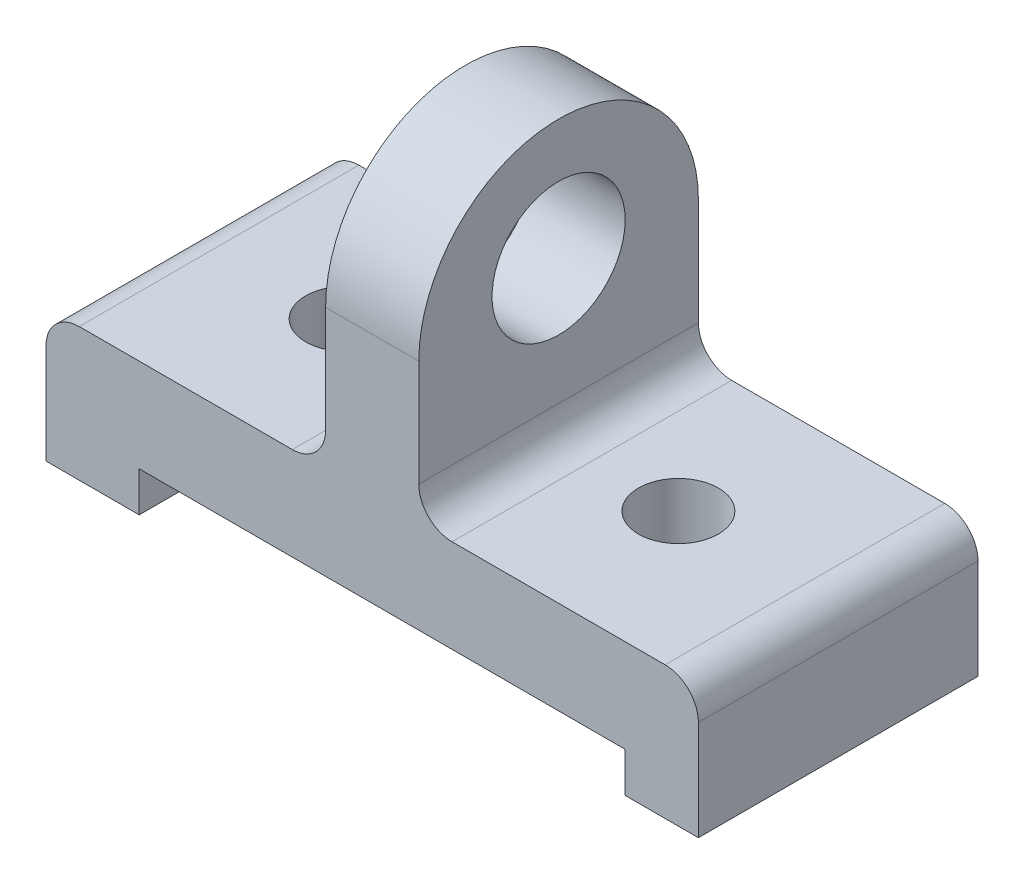
ISO-10303-21;
HEADER;
FILE_DESCRIPTION(('STEP AP214'),'2;1');
FILE_NAME('part.step','',(''),(''),'','','');
FILE_SCHEMA(('AUTOMOTIVE_DESIGN { 1 0 10303 214 1 1 1 1 }'));
ENDSEC;
DATA;
#1=APPLICATION_CONTEXT('core data for automotive mechanical design processes');
#2=APPLICATION_PROTOCOL_DEFINITION('international standard','automotive_design',2000,#1);
#3=PRODUCT_CONTEXT('',#1,'mechanical');
#4=PRODUCT('Part','Part','',(#3));
#5=PRODUCT_RELATED_PRODUCT_CATEGORY('part','',(#4));
#6=PRODUCT_DEFINITION_FORMATION('','',#4);
#7=PRODUCT_DEFINITION_CONTEXT('part definition',#1,'design');
#8=PRODUCT_DEFINITION('design','',#6,#7);
#9=PRODUCT_DEFINITION_SHAPE('','',#8);
#10=(LENGTH_UNIT() NAMED_UNIT(*) SI_UNIT(.MILLI.,.METRE.));
#11=(NAMED_UNIT(*) PLANE_ANGLE_UNIT() SI_UNIT($,.RADIAN.));
#12=(NAMED_UNIT(*) SI_UNIT($,.STERADIAN.) SOLID_ANGLE_UNIT());
#13=UNCERTAINTY_MEASURE_WITH_UNIT(LENGTH_MEASURE(1.E-05),#10,'distance_accuracy_value','');
#14=(GEOMETRIC_REPRESENTATION_CONTEXT(3) GLOBAL_UNCERTAINTY_ASSIGNED_CONTEXT((#13)) GLOBAL_UNIT_ASSIGNED_CONTEXT((#10,
#11,#12)) REPRESENTATION_CONTEXT('',''));
#15=CARTESIAN_POINT('',(0.,0.,0.));
#16=DIRECTION('',(0.,0.,1.));
#17=DIRECTION('',(1.,0.,0.));
#18=AXIS2_PLACEMENT_3D('',#15,#16,#17);
#19=CARTESIAN_POINT('',(0.,14.,0.));
#20=DIRECTION('',(0.,1.,0.));
#21=DIRECTION('',(0.,0.,1.));
#22=AXIS2_PLACEMENT_3D('',#19,#20,#21);
#23=PLANE('',#22);
#24=CARTESIAN_POINT('',(25.,14.,0.));
#25=DIRECTION('',(0.,1.,0.));
#26=DIRECTION('',(0.,0.,1.));
#27=AXIS2_PLACEMENT_3D('',#24,#25,#26);
#28=CIRCLE('',#27,6.);
#29=CARTESIAN_POINT('',(25.,14.,6.));
#30=VERTEX_POINT('',#29);
#31=EDGE_CURVE('E184',#30,#30,#28,.T.);
#32=ORIENTED_EDGE('',*,*,#31,.F.);
#33=EDGE_LOOP('',(#32));
#34=FACE_BOUND('',#33,.T.);
#35=DIRECTION('',(-1.,0.,0.));
#36=VECTOR('',#35,1.);
#37=CARTESIAN_POINT('',(-49.,14.,-21.));
#38=LINE('',#37,#36);
#39=CARTESIAN_POINT('',(44.,14.,-21.));
#40=VERTEX_POINT('',#39);
#41=CARTESIAN_POINT('',(12.,14.,-21.));
#42=VERTEX_POINT('',#41);
#43=EDGE_CURVE('E234',#40,#42,#38,.T.);
#44=ORIENTED_EDGE('',*,*,#43,.T.);
#45=DIRECTION('',(0.,0.,-1.));
#46=VECTOR('',#45,1.);
#47=CARTESIAN_POINT('',(12.,14.,0.));
#48=LINE('',#47,#46);
#49=CARTESIAN_POINT('',(12.,14.,21.));
#50=VERTEX_POINT('',#49);
#51=EDGE_CURVE('E275',#42,#50,#48,.F.);
#52=ORIENTED_EDGE('',*,*,#51,.T.);
#53=DIRECTION('',(1.,0.,0.));
#54=VECTOR('',#53,1.);
#55=CARTESIAN_POINT('',(-49.,14.,21.));
#56=LINE('',#55,#54);
#57=CARTESIAN_POINT('',(44.,14.,21.));
#58=VERTEX_POINT('',#57);
#59=EDGE_CURVE('E237',#50,#58,#56,.T.);
#60=ORIENTED_EDGE('',*,*,#59,.T.);
#61=DIRECTION('',(0.,0.,-1.));
#62=VECTOR('',#61,1.);
#63=CARTESIAN_POINT('',(44.,14.,-21.));
#64=LINE('',#63,#62);
#65=EDGE_CURVE('E254',#58,#40,#64,.T.);
#66=ORIENTED_EDGE('',*,*,#65,.T.);
#67=EDGE_LOOP('',(#44,#52,#60,#66));
#68=FACE_BOUND('',#67,.T.);
#69=ADVANCED_FACE('F33',(#34,#68),#23,.T.);
#70=CARTESIAN_POINT('',(49.,14.,-21.));
#71=DIRECTION('',(-1.,0.,0.));
#72=DIRECTION('',(0.,0.,1.));
#73=AXIS2_PLACEMENT_3D('',#70,#71,#72);
#74=PLANE('',#73);
#75=DIRECTION('',(0.,-1.,0.));
#76=VECTOR('',#75,1.);
#77=CARTESIAN_POINT('',(49.,14.,-21.));
#78=LINE('',#77,#76);
#79=CARTESIAN_POINT('',(49.,9.,-21.));
#80=VERTEX_POINT('',#79);
#81=CARTESIAN_POINT('',(49.,-6.,-21.));
#82=VERTEX_POINT('',#81);
#83=EDGE_CURVE('E252',#80,#82,#78,.T.);
#84=ORIENTED_EDGE('',*,*,#83,.F.);
#85=DIRECTION('',(0.,0.,-1.));
#86=VECTOR('',#85,1.);
#87=CARTESIAN_POINT('',(49.,9.,21.));
#88=LINE('',#87,#86);
#89=CARTESIAN_POINT('',(49.,9.,21.));
#90=VERTEX_POINT('',#89);
#91=EDGE_CURVE('E259',#80,#90,#88,.F.);
#92=ORIENTED_EDGE('',*,*,#91,.T.);
#93=DIRECTION('',(0.,-1.,0.));
#94=VECTOR('',#93,1.);
#95=CARTESIAN_POINT('',(49.,14.,21.));
#96=LINE('',#95,#94);
#97=CARTESIAN_POINT('',(49.,-6.,21.));
#98=VERTEX_POINT('',#97);
#99=EDGE_CURVE('E242',#90,#98,#96,.T.);
#100=ORIENTED_EDGE('',*,*,#99,.T.);
#101=DIRECTION('',(0.,0.,1.));
#102=VECTOR('',#101,1.);
#103=CARTESIAN_POINT('',(49.,-6.,-21.));
#104=LINE('',#103,#102);
#105=EDGE_CURVE('E226',#82,#98,#104,.T.);
#106=ORIENTED_EDGE('',*,*,#105,.F.);
#107=EDGE_LOOP('',(#84,#92,#100,#106));
#108=FACE_BOUND('',#107,.T.);
#109=ADVANCED_FACE('F307',(#108),#74,.F.);
#110=CARTESIAN_POINT('',(-49.,14.,-21.));
#111=DIRECTION('',(0.,0.,1.));
#112=DIRECTION('',(1.,0.,0.));
#113=AXIS2_PLACEMENT_3D('',#110,#111,#112);
#114=PLANE('',#113);
#115=DIRECTION('',(0.,-1.,0.));
#116=VECTOR('',#115,1.);
#117=CARTESIAN_POINT('',(-49.,14.,-21.));
#118=LINE('',#117,#116);
#119=CARTESIAN_POINT('',(-49.,9.,-21.));
#120=VERTEX_POINT('',#119);
#121=CARTESIAN_POINT('',(-49.,-6.,-21.));
#122=VERTEX_POINT('',#121);
#123=EDGE_CURVE('E250',#120,#122,#118,.T.);
#124=ORIENTED_EDGE('',*,*,#123,.F.);
#125=CARTESIAN_POINT('',(-44.,9.,-21.));
#126=DIRECTION('',(0.,0.,1.));
#127=DIRECTION('',(1.,0.,0.));
#128=AXIS2_PLACEMENT_3D('',#125,#126,#127);
#129=CIRCLE('',#128,5.);
#130=CARTESIAN_POINT('',(-44.,14.,-21.));
#131=VERTEX_POINT('',#130);
#132=EDGE_CURVE('E271',#120,#131,#129,.F.);
#133=ORIENTED_EDGE('',*,*,#132,.T.);
#134=CARTESIAN_POINT('',(-12.,14.,-21.));
#135=VERTEX_POINT('',#134);
#136=EDGE_CURVE('E238',#135,#131,#38,.T.);
#137=ORIENTED_EDGE('',*,*,#136,.F.);
#138=CARTESIAN_POINT('',(-12.,19.,-21.));
#139=DIRECTION('',(0.,0.,1.));
#140=DIRECTION('',(1.,0.,0.));
#141=AXIS2_PLACEMENT_3D('',#138,#139,#140);
#142=CIRCLE('',#141,5.);
#143=CARTESIAN_POINT('',(-7.,19.,-21.));
#144=VERTEX_POINT('',#143);
#145=EDGE_CURVE('E41',#135,#144,#142,.T.);
#146=ORIENTED_EDGE('',*,*,#145,.T.);
#147=DIRECTION('',(0.,1.,0.));
#148=VECTOR('',#147,1.);
#149=CARTESIAN_POINT('',(-7.,14.,-21.));
#150=LINE('',#149,#148);
#151=CARTESIAN_POINT('',(-7.,35.,-21.));
#152=VERTEX_POINT('',#151);
#153=EDGE_CURVE('E162',#144,#152,#150,.T.);
#154=ORIENTED_EDGE('',*,*,#153,.T.);
#155=DIRECTION('',(1.,0.,0.));
#156=VECTOR('',#155,1.);
#157=CARTESIAN_POINT('',(-7.,35.,-21.));
#158=LINE('',#157,#156);
#159=CARTESIAN_POINT('',(7.,35.,-21.));
#160=VERTEX_POINT('',#159);
#161=EDGE_CURVE('E159',#152,#160,#158,.T.);
#162=ORIENTED_EDGE('',*,*,#161,.T.);
#163=DIRECTION('',(0.,1.,0.));
#164=VECTOR('',#163,1.);
#165=CARTESIAN_POINT('',(7.,14.,-21.));
#166=LINE('',#165,#164);
#167=CARTESIAN_POINT('',(7.,19.,-21.));
#168=VERTEX_POINT('',#167);
#169=EDGE_CURVE('E146',#168,#160,#166,.T.);
#170=ORIENTED_EDGE('',*,*,#169,.F.);
#171=CARTESIAN_POINT('',(12.,19.,-21.));
#172=DIRECTION('',(0.,0.,1.));
#173=DIRECTION('',(1.,0.,0.));
#174=AXIS2_PLACEMENT_3D('',#171,#172,#173);
#175=CIRCLE('',#174,5.);
#176=EDGE_CURVE('E277',#168,#42,#175,.T.);
#177=ORIENTED_EDGE('',*,*,#176,.T.);
#178=ORIENTED_EDGE('',*,*,#43,.F.);
#179=CARTESIAN_POINT('',(44.,9.,-21.));
#180=DIRECTION('',(0.,0.,1.));
#181=DIRECTION('',(1.,0.,0.));
#182=AXIS2_PLACEMENT_3D('',#179,#180,#181);
#183=CIRCLE('',#182,5.);
#184=EDGE_CURVE('E257',#40,#80,#183,.F.);
#185=ORIENTED_EDGE('',*,*,#184,.T.);
#186=ORIENTED_EDGE('',*,*,#83,.T.);
#187=DIRECTION('',(1.,0.,0.));
#188=VECTOR('',#187,1.);
#189=CARTESIAN_POINT('',(49.,-6.,-21.));
#190=LINE('',#189,#188);
#191=CARTESIAN_POINT('',(37.9824474250704,-6.,-21.));
#192=VERTEX_POINT('',#191);
#193=EDGE_CURVE('E222',#192,#82,#190,.T.);
#194=ORIENTED_EDGE('',*,*,#193,.F.);
#195=DIRECTION('',(0.,-1.,0.));
#196=VECTOR('',#195,1.);
#197=CARTESIAN_POINT('',(37.9824474250704,-6.,-21.));
#198=LINE('',#197,#196);
#199=CARTESIAN_POINT('',(37.9824474250704,0.,-21.));
#200=VERTEX_POINT('',#199);
#201=EDGE_CURVE('E219',#200,#192,#198,.T.);
#202=ORIENTED_EDGE('',*,*,#201,.F.);
#203=DIRECTION('',(-1.,0.,0.));
#204=VECTOR('',#203,1.);
#205=CARTESIAN_POINT('',(-49.,0.,-21.));
#206=LINE('',#205,#204);
#207=CARTESIAN_POINT('',(-35.,0.,-21.));
#208=VERTEX_POINT('',#207);
#209=EDGE_CURVE('E229',#200,#208,#206,.T.);
#210=ORIENTED_EDGE('',*,*,#209,.T.);
#211=DIRECTION('',(0.,1.,0.));
#212=VECTOR('',#211,1.);
#213=CARTESIAN_POINT('',(-35.,-6.,-21.));
#214=LINE('',#213,#212);
#215=CARTESIAN_POINT('',(-35.,-6.,-21.));
#216=VERTEX_POINT('',#215);
#217=EDGE_CURVE('E199',#216,#208,#214,.T.);
#218=ORIENTED_EDGE('',*,*,#217,.F.);
#219=DIRECTION('',(1.,0.,0.));
#220=VECTOR('',#219,1.);
#221=CARTESIAN_POINT('',(-49.,-6.,-21.));
#222=LINE('',#221,#220);
#223=EDGE_CURVE('E196',#122,#216,#222,.T.);
#224=ORIENTED_EDGE('',*,*,#223,.F.);
#225=EDGE_LOOP('',(#124,#133,#137,#146,#154,#162,#170,#177,#178,#185,#186,#194,#202,#210,#218,#224));
#226=FACE_BOUND('',#225,.T.);
#227=ADVANCED_FACE('F161',(#226),#114,.F.);
#228=CARTESIAN_POINT('',(-49.,14.,-21.));
#229=DIRECTION('',(1.,0.,0.));
#230=DIRECTION('',(0.,0.,-1.));
#231=AXIS2_PLACEMENT_3D('',#228,#229,#230);
#232=PLANE('',#231);
#233=DIRECTION('',(0.,-1.,0.));
#234=VECTOR('',#233,1.);
#235=CARTESIAN_POINT('',(-49.,14.,21.));
#236=LINE('',#235,#234);
#237=CARTESIAN_POINT('',(-49.,9.,21.));
#238=VERTEX_POINT('',#237);
#239=CARTESIAN_POINT('',(-49.,-6.,21.));
#240=VERTEX_POINT('',#239);
#241=EDGE_CURVE('E248',#238,#240,#236,.T.);
#242=ORIENTED_EDGE('',*,*,#241,.F.);
#243=DIRECTION('',(0.,0.,1.));
#244=VECTOR('',#243,1.);
#245=CARTESIAN_POINT('',(-49.,9.,-21.));
#246=LINE('',#245,#244);
#247=EDGE_CURVE('E269',#238,#120,#246,.F.);
#248=ORIENTED_EDGE('',*,*,#247,.T.);
#249=ORIENTED_EDGE('',*,*,#123,.T.);
#250=DIRECTION('',(0.,0.,1.));
#251=VECTOR('',#250,1.);
#252=CARTESIAN_POINT('',(-49.,-6.,-21.));
#253=LINE('',#252,#251);
#254=EDGE_CURVE('E202',#122,#240,#253,.T.);
#255=ORIENTED_EDGE('',*,*,#254,.T.);
#256=EDGE_LOOP('',(#242,#248,#249,#255));
#257=FACE_BOUND('',#256,.T.);
#258=ADVANCED_FACE('F327',(#257),#232,.F.);
#259=CARTESIAN_POINT('',(-49.,14.,21.));
#260=DIRECTION('',(0.,0.,-1.));
#261=DIRECTION('',(-1.,0.,0.));
#262=AXIS2_PLACEMENT_3D('',#259,#260,#261);
#263=PLANE('',#262);
#264=CARTESIAN_POINT('',(-44.,14.,21.));
#265=VERTEX_POINT('',#264);
#266=CARTESIAN_POINT('',(-12.,14.,21.));
#267=VERTEX_POINT('',#266);
#268=EDGE_CURVE('E239',#265,#267,#56,.T.);
#269=ORIENTED_EDGE('',*,*,#268,.F.);
#270=CARTESIAN_POINT('',(-44.,9.,21.));
#271=DIRECTION('',(0.,0.,-1.));
#272=DIRECTION('',(-1.,0.,0.));
#273=AXIS2_PLACEMENT_3D('',#270,#271,#272);
#274=CIRCLE('',#273,5.);
#275=EDGE_CURVE('E267',#265,#238,#274,.F.);
#276=ORIENTED_EDGE('',*,*,#275,.T.);
#277=ORIENTED_EDGE('',*,*,#241,.T.);
#278=DIRECTION('',(1.,0.,0.));
#279=VECTOR('',#278,1.);
#280=CARTESIAN_POINT('',(-49.,-6.,21.));
#281=LINE('',#280,#279);
#282=CARTESIAN_POINT('',(-35.,-6.,21.));
#283=VERTEX_POINT('',#282);
#284=EDGE_CURVE('E187',#240,#283,#281,.T.);
#285=ORIENTED_EDGE('',*,*,#284,.T.);
#286=DIRECTION('',(0.,1.,0.));
#287=VECTOR('',#286,1.);
#288=CARTESIAN_POINT('',(-35.,-6.,21.));
#289=LINE('',#288,#287);
#290=CARTESIAN_POINT('',(-35.,0.,21.));
#291=VERTEX_POINT('',#290);
#292=EDGE_CURVE('E200',#283,#291,#289,.T.);
#293=ORIENTED_EDGE('',*,*,#292,.T.);
#294=DIRECTION('',(1.,0.,0.));
#295=VECTOR('',#294,1.);
#296=CARTESIAN_POINT('',(-49.,0.,21.));
#297=LINE('',#296,#295);
#298=CARTESIAN_POINT('',(37.9824474250704,0.,21.));
#299=VERTEX_POINT('',#298);
#300=EDGE_CURVE('E245',#291,#299,#297,.T.);
#301=ORIENTED_EDGE('',*,*,#300,.T.);
#302=DIRECTION('',(0.,-1.,0.));
#303=VECTOR('',#302,1.);
#304=CARTESIAN_POINT('',(37.9824474250704,-6.,21.));
#305=LINE('',#304,#303);
#306=CARTESIAN_POINT('',(37.9824474250704,-6.,21.));
#307=VERTEX_POINT('',#306);
#308=EDGE_CURVE('E209',#299,#307,#305,.T.);
#309=ORIENTED_EDGE('',*,*,#308,.T.);
#310=DIRECTION('',(1.,0.,0.));
#311=VECTOR('',#310,1.);
#312=CARTESIAN_POINT('',(49.,-6.,21.));
#313=LINE('',#312,#311);
#314=EDGE_CURVE('E216',#307,#98,#313,.T.);
#315=ORIENTED_EDGE('',*,*,#314,.T.);
#316=ORIENTED_EDGE('',*,*,#99,.F.);
#317=CARTESIAN_POINT('',(44.,9.,21.));
#318=DIRECTION('',(0.,0.,-1.));
#319=DIRECTION('',(-1.,0.,0.));
#320=AXIS2_PLACEMENT_3D('',#317,#318,#319);
#321=CIRCLE('',#320,5.);
#322=EDGE_CURVE('E261',#90,#58,#321,.F.);
#323=ORIENTED_EDGE('',*,*,#322,.T.);
#324=ORIENTED_EDGE('',*,*,#59,.F.);
#325=CARTESIAN_POINT('',(12.,19.,21.));
#326=DIRECTION('',(0.,0.,-1.));
#327=DIRECTION('',(-1.,0.,0.));
#328=AXIS2_PLACEMENT_3D('',#325,#326,#327);
#329=CIRCLE('',#328,5.);
#330=CARTESIAN_POINT('',(7.,19.,21.));
#331=VERTEX_POINT('',#330);
#332=EDGE_CURVE('E279',#50,#331,#329,.T.);
#333=ORIENTED_EDGE('',*,*,#332,.T.);
#334=DIRECTION('',(0.,-1.,0.));
#335=VECTOR('',#334,1.);
#336=CARTESIAN_POINT('',(7.,14.,21.));
#337=LINE('',#336,#335);
#338=CARTESIAN_POINT('',(7.,35.,21.));
#339=VERTEX_POINT('',#338);
#340=EDGE_CURVE('E170',#339,#331,#337,.T.);
#341=ORIENTED_EDGE('',*,*,#340,.F.);
#342=DIRECTION('',(1.,0.,0.));
#343=VECTOR('',#342,1.);
#344=CARTESIAN_POINT('',(-7.,35.,21.));
#345=LINE('',#344,#343);
#346=CARTESIAN_POINT('',(-7.,35.,21.));
#347=VERTEX_POINT('',#346);
#348=EDGE_CURVE('E166',#347,#339,#345,.T.);
#349=ORIENTED_EDGE('',*,*,#348,.F.);
#350=DIRECTION('',(0.,-1.,0.));
#351=VECTOR('',#350,1.);
#352=CARTESIAN_POINT('',(-7.,14.,21.));
#353=LINE('',#352,#351);
#354=CARTESIAN_POINT('',(-7.,19.,21.));
#355=VERTEX_POINT('',#354);
#356=EDGE_CURVE('E167',#347,#355,#353,.T.);
#357=ORIENTED_EDGE('',*,*,#356,.T.);
#358=CARTESIAN_POINT('',(-12.,19.,21.));
#359=DIRECTION('',(0.,0.,-1.));
#360=DIRECTION('',(-1.,0.,0.));
#361=AXIS2_PLACEMENT_3D('',#358,#359,#360);
#362=CIRCLE('',#361,5.);
#363=EDGE_CURVE('E11',#355,#267,#362,.T.);
#364=ORIENTED_EDGE('',*,*,#363,.T.);
#365=EDGE_LOOP('',(#269,#276,#277,#285,#293,#301,#309,#315,#316,#323,#324,#333,#341,#349,#357,#364));
#366=FACE_BOUND('',#365,.T.);
#367=ADVANCED_FACE('F298',(#366),#263,.F.);
#368=ORIENTED_EDGE('',*,*,#268,.T.);
#369=DIRECTION('',(0.,0.,-1.));
#370=VECTOR('',#369,1.);
#371=CARTESIAN_POINT('',(-12.,14.,-21.));
#372=LINE('',#371,#370);
#373=EDGE_CURVE('E281',#267,#135,#372,.T.);
#374=ORIENTED_EDGE('',*,*,#373,.T.);
#375=ORIENTED_EDGE('',*,*,#136,.T.);
#376=DIRECTION('',(0.,0.,1.));
#377=VECTOR('',#376,1.);
#378=CARTESIAN_POINT('',(-44.,14.,21.));
#379=LINE('',#378,#377);
#380=EDGE_CURVE('E264',#131,#265,#379,.T.);
#381=ORIENTED_EDGE('',*,*,#380,.T.);
#382=EDGE_LOOP('',(#368,#374,#375,#381));
#383=FACE_BOUND('',#382,.T.);
#384=CARTESIAN_POINT('',(-25.,14.,0.));
#385=DIRECTION('',(0.,1.,0.));
#386=DIRECTION('',(0.,0.,-1.));
#387=AXIS2_PLACEMENT_3D('',#384,#385,#386);
#388=CIRCLE('',#387,6.);
#389=CARTESIAN_POINT('',(-25.,14.,-6.00000000000001));
#390=VERTEX_POINT('',#389);
#391=EDGE_CURVE('E191',#390,#390,#388,.T.);
#392=ORIENTED_EDGE('',*,*,#391,.F.);
#393=EDGE_LOOP('',(#392));
#394=FACE_BOUND('',#393,.T.);
#395=ADVANCED_FACE('F286',(#383,#394),#23,.T.);
#396=CARTESIAN_POINT('',(0.,0.,0.));
#397=DIRECTION('',(0.,1.,0.));
#398=DIRECTION('',(0.,0.,1.));
#399=AXIS2_PLACEMENT_3D('',#396,#397,#398);
#400=PLANE('',#399);
#401=CARTESIAN_POINT('',(25.,0.,0.));
#402=DIRECTION('',(0.,1.,0.));
#403=DIRECTION('',(0.,0.,1.));
#404=AXIS2_PLACEMENT_3D('',#401,#402,#403);
#405=CIRCLE('',#404,6.);
#406=CARTESIAN_POINT('',(25.,0.,6.));
#407=VERTEX_POINT('',#406);
#408=EDGE_CURVE('E188',#407,#407,#405,.T.);
#409=ORIENTED_EDGE('',*,*,#408,.T.);
#410=EDGE_LOOP('',(#409));
#411=FACE_BOUND('',#410,.T.);
#412=CARTESIAN_POINT('',(-25.,0.,0.));
#413=DIRECTION('',(0.,1.,0.));
#414=DIRECTION('',(0.,0.,-1.));
#415=AXIS2_PLACEMENT_3D('',#412,#413,#414);
#416=CIRCLE('',#415,6.);
#417=CARTESIAN_POINT('',(-25.,0.,-6.00000000000001));
#418=VERTEX_POINT('',#417);
#419=EDGE_CURVE('E182',#418,#418,#416,.T.);
#420=ORIENTED_EDGE('',*,*,#419,.T.);
#421=EDGE_LOOP('',(#420));
#422=FACE_BOUND('',#421,.T.);
#423=ORIENTED_EDGE('',*,*,#300,.F.);
#424=DIRECTION('',(0.,0.,1.));
#425=VECTOR('',#424,1.);
#426=CARTESIAN_POINT('',(-35.,0.,-21.));
#427=LINE('',#426,#425);
#428=EDGE_CURVE('E206',#208,#291,#427,.T.);
#429=ORIENTED_EDGE('',*,*,#428,.F.);
#430=ORIENTED_EDGE('',*,*,#209,.F.);
#431=DIRECTION('',(0.,0.,1.));
#432=VECTOR('',#431,1.);
#433=CARTESIAN_POINT('',(37.9824474250704,0.,-21.));
#434=LINE('',#433,#432);
#435=EDGE_CURVE('E225',#200,#299,#434,.T.);
#436=ORIENTED_EDGE('',*,*,#435,.T.);
#437=EDGE_LOOP('',(#423,#429,#430,#436));
#438=FACE_BOUND('',#437,.T.);
#439=ADVANCED_FACE('F320',(#411,#422,#438),#400,.F.);
#440=CARTESIAN_POINT('',(49.,-6.,-21.));
#441=DIRECTION('',(0.,-1.,0.));
#442=DIRECTION('',(1.,0.,0.));
#443=AXIS2_PLACEMENT_3D('',#440,#441,#442);
#444=PLANE('',#443);
#445=ORIENTED_EDGE('',*,*,#105,.T.);
#446=ORIENTED_EDGE('',*,*,#314,.F.);
#447=DIRECTION('',(0.,0.,1.));
#448=VECTOR('',#447,1.);
#449=CARTESIAN_POINT('',(37.9824474250704,-6.,-21.));
#450=LINE('',#449,#448);
#451=EDGE_CURVE('E230',#192,#307,#450,.T.);
#452=ORIENTED_EDGE('',*,*,#451,.F.);
#453=ORIENTED_EDGE('',*,*,#193,.T.);
#454=EDGE_LOOP('',(#445,#446,#452,#453));
#455=FACE_BOUND('',#454,.T.);
#456=ADVANCED_FACE('F325',(#455),#444,.T.);
#457=CARTESIAN_POINT('',(37.9824474250704,-6.,-21.));
#458=DIRECTION('',(-1.,0.,0.));
#459=DIRECTION('',(0.,0.,1.));
#460=AXIS2_PLACEMENT_3D('',#457,#458,#459);
#461=PLANE('',#460);
#462=ORIENTED_EDGE('',*,*,#451,.T.);
#463=ORIENTED_EDGE('',*,*,#308,.F.);
#464=ORIENTED_EDGE('',*,*,#435,.F.);
#465=ORIENTED_EDGE('',*,*,#201,.T.);
#466=EDGE_LOOP('',(#462,#463,#464,#465));
#467=FACE_BOUND('',#466,.T.);
#468=ADVANCED_FACE('F341',(#467),#461,.T.);
#469=CARTESIAN_POINT('',(44.,9.,0.));
#470=DIRECTION('',(0.,0.,1.));
#471=DIRECTION('',(1.,0.,0.));
#472=AXIS2_PLACEMENT_3D('',#469,#470,#471);
#473=CYLINDRICAL_SURFACE('',#472,5.);
#474=ORIENTED_EDGE('',*,*,#322,.F.);
#475=ORIENTED_EDGE('',*,*,#91,.F.);
#476=ORIENTED_EDGE('',*,*,#184,.F.);
#477=ORIENTED_EDGE('',*,*,#65,.F.);
#478=EDGE_LOOP('',(#474,#475,#476,#477));
#479=FACE_BOUND('',#478,.T.);
#480=ADVANCED_FACE('F337',(#479),#473,.T.);
#481=CARTESIAN_POINT('',(-35.,-6.,-21.));
#482=DIRECTION('',(1.,0.,0.));
#483=DIRECTION('',(0.,0.,-1.));
#484=AXIS2_PLACEMENT_3D('',#481,#482,#483);
#485=PLANE('',#484);
#486=ORIENTED_EDGE('',*,*,#292,.F.);
#487=DIRECTION('',(0.,0.,1.));
#488=VECTOR('',#487,1.);
#489=CARTESIAN_POINT('',(-35.,-6.,-21.));
#490=LINE('',#489,#488);
#491=EDGE_CURVE('E210',#216,#283,#490,.T.);
#492=ORIENTED_EDGE('',*,*,#491,.F.);
#493=ORIENTED_EDGE('',*,*,#217,.T.);
#494=ORIENTED_EDGE('',*,*,#428,.T.);
#495=EDGE_LOOP('',(#486,#492,#493,#494));
#496=FACE_BOUND('',#495,.T.);
#497=ADVANCED_FACE('F340',(#496),#485,.T.);
#498=CARTESIAN_POINT('',(-49.,-6.,-21.));
#499=DIRECTION('',(0.,-1.,0.));
#500=DIRECTION('',(0.,0.,-1.));
#501=AXIS2_PLACEMENT_3D('',#498,#499,#500);
#502=PLANE('',#501);
#503=ORIENTED_EDGE('',*,*,#284,.F.);
#504=ORIENTED_EDGE('',*,*,#254,.F.);
#505=ORIENTED_EDGE('',*,*,#223,.T.);
#506=ORIENTED_EDGE('',*,*,#491,.T.);
#507=EDGE_LOOP('',(#503,#504,#505,#506));
#508=FACE_BOUND('',#507,.T.);
#509=ADVANCED_FACE('F345',(#508),#502,.T.);
#510=CARTESIAN_POINT('',(-44.,9.,0.));
#511=DIRECTION('',(0.,0.,-1.));
#512=DIRECTION('',(-1.,0.,0.));
#513=AXIS2_PLACEMENT_3D('',#510,#511,#512);
#514=CYLINDRICAL_SURFACE('',#513,5.);
#515=ORIENTED_EDGE('',*,*,#132,.F.);
#516=ORIENTED_EDGE('',*,*,#247,.F.);
#517=ORIENTED_EDGE('',*,*,#275,.F.);
#518=ORIENTED_EDGE('',*,*,#380,.F.);
#519=EDGE_LOOP('',(#515,#516,#517,#518));
#520=FACE_BOUND('',#519,.T.);
#521=ADVANCED_FACE('F296',(#520),#514,.T.);
#522=CARTESIAN_POINT('',(-25.,14.,0.));
#523=DIRECTION('',(0.,-1.,0.));
#524=DIRECTION('',(0.,0.,-1.));
#525=AXIS2_PLACEMENT_3D('',#522,#523,#524);
#526=CYLINDRICAL_SURFACE('',#525,6.);
#527=ORIENTED_EDGE('',*,*,#391,.T.);
#528=EDGE_LOOP('',(#527));
#529=FACE_BOUND('',#528,.T.);
#530=ORIENTED_EDGE('',*,*,#419,.F.);
#531=EDGE_LOOP('',(#530));
#532=FACE_BOUND('',#531,.T.);
#533=ADVANCED_FACE('F344',(#529,#532),#526,.F.);
#534=CARTESIAN_POINT('',(25.,14.,0.));
#535=DIRECTION('',(0.,-1.,0.));
#536=DIRECTION('',(0.,0.,-1.));
#537=AXIS2_PLACEMENT_3D('',#534,#535,#536);
#538=CYLINDRICAL_SURFACE('',#537,6.);
#539=ORIENTED_EDGE('',*,*,#31,.T.);
#540=EDGE_LOOP('',(#539));
#541=FACE_BOUND('',#540,.T.);
#542=ORIENTED_EDGE('',*,*,#408,.F.);
#543=EDGE_LOOP('',(#542));
#544=FACE_BOUND('',#543,.T.);
#545=ADVANCED_FACE('F350',(#541,#544),#538,.F.);
#546=CARTESIAN_POINT('',(-7.,35.,0.));
#547=DIRECTION('',(1.,0.,0.));
#548=DIRECTION('',(0.,0.,-1.));
#549=AXIS2_PLACEMENT_3D('',#546,#547,#548);
#550=CYLINDRICAL_SURFACE('',#549,21.);
#551=ORIENTED_EDGE('',*,*,#348,.T.);
#552=CARTESIAN_POINT('',(7.,35.,0.));
#553=DIRECTION('',(1.,0.,0.));
#554=DIRECTION('',(0.,0.,1.));
#555=AXIS2_PLACEMENT_3D('',#552,#553,#554);
#556=CIRCLE('',#555,21.);
#557=EDGE_CURVE('E152',#160,#339,#556,.T.);
#558=ORIENTED_EDGE('',*,*,#557,.F.);
#559=ORIENTED_EDGE('',*,*,#161,.F.);
#560=CARTESIAN_POINT('',(-7.,35.,0.));
#561=DIRECTION('',(1.,0.,0.));
#562=DIRECTION('',(0.,0.,1.));
#563=AXIS2_PLACEMENT_3D('',#560,#561,#562);
#564=CIRCLE('',#563,21.);
#565=EDGE_CURVE('E179',#152,#347,#564,.T.);
#566=ORIENTED_EDGE('',*,*,#565,.T.);
#567=EDGE_LOOP('',(#551,#558,#559,#566));
#568=FACE_BOUND('',#567,.T.);
#569=ADVANCED_FACE('F169',(#568),#550,.T.);
#570=CARTESIAN_POINT('',(-7.,35.,0.));
#571=DIRECTION('',(-1.,0.,0.));
#572=DIRECTION('',(0.,0.,1.));
#573=AXIS2_PLACEMENT_3D('',#570,#571,#572);
#574=PLANE('',#573);
#575=CARTESIAN_POINT('',(-7.,37.8957513682221,0.));
#576=DIRECTION('',(1.,0.,0.));
#577=DIRECTION('',(0.,0.,-1.));
#578=AXIS2_PLACEMENT_3D('',#575,#576,#577);
#579=CIRCLE('',#578,10.);
#580=CARTESIAN_POINT('',(-7.,37.8957513682221,-10.));
#581=VERTEX_POINT('',#580);
#582=EDGE_CURVE('E172',#581,#581,#579,.T.);
#583=ORIENTED_EDGE('',*,*,#582,.T.);
#584=EDGE_LOOP('',(#583));
#585=FACE_BOUND('',#584,.T.);
#586=ORIENTED_EDGE('',*,*,#153,.F.);
#587=DIRECTION('',(0.,0.,-1.));
#588=VECTOR('',#587,1.);
#589=CARTESIAN_POINT('',(-7.,19.,21.));
#590=LINE('',#589,#588);
#591=EDGE_CURVE('E54',#144,#355,#590,.F.);
#592=ORIENTED_EDGE('',*,*,#591,.T.);
#593=ORIENTED_EDGE('',*,*,#356,.F.);
#594=ORIENTED_EDGE('',*,*,#565,.F.);
#595=EDGE_LOOP('',(#586,#592,#593,#594));
#596=FACE_BOUND('',#595,.T.);
#597=ADVANCED_FACE('F383',(#585,#596),#574,.T.);
#598=CARTESIAN_POINT('',(-7.,37.8957513682221,0.));
#599=DIRECTION('',(1.,0.,0.));
#600=DIRECTION('',(0.,0.,-1.));
#601=AXIS2_PLACEMENT_3D('',#598,#599,#600);
#602=CYLINDRICAL_SURFACE('',#601,10.);
#603=ORIENTED_EDGE('',*,*,#582,.F.);
#604=EDGE_LOOP('',(#603));
#605=FACE_BOUND('',#604,.T.);
#606=CARTESIAN_POINT('',(7.,37.8957513682221,0.));
#607=DIRECTION('',(1.,0.,0.));
#608=DIRECTION('',(0.,0.,-1.));
#609=AXIS2_PLACEMENT_3D('',#606,#607,#608);
#610=CIRCLE('',#609,10.);
#611=CARTESIAN_POINT('',(7.,37.8957513682221,-10.));
#612=VERTEX_POINT('',#611);
#613=EDGE_CURVE('E156',#612,#612,#610,.T.);
#614=ORIENTED_EDGE('',*,*,#613,.T.);
#615=EDGE_LOOP('',(#614));
#616=FACE_BOUND('',#615,.T.);
#617=ADVANCED_FACE('F385',(#605,#616),#602,.F.);
#618=CARTESIAN_POINT('',(7.,35.,0.));
#619=DIRECTION('',(-1.,0.,0.));
#620=DIRECTION('',(0.,0.,1.));
#621=AXIS2_PLACEMENT_3D('',#618,#619,#620);
#622=PLANE('',#621);
#623=ORIENTED_EDGE('',*,*,#340,.T.);
#624=DIRECTION('',(0.,0.,-1.));
#625=VECTOR('',#624,1.);
#626=CARTESIAN_POINT('',(7.,19.,0.));
#627=LINE('',#626,#625);
#628=EDGE_CURVE('E155',#331,#168,#627,.T.);
#629=ORIENTED_EDGE('',*,*,#628,.T.);
#630=ORIENTED_EDGE('',*,*,#169,.T.);
#631=ORIENTED_EDGE('',*,*,#557,.T.);
#632=EDGE_LOOP('',(#623,#629,#630,#631));
#633=FACE_BOUND('',#632,.T.);
#634=ORIENTED_EDGE('',*,*,#613,.F.);
#635=EDGE_LOOP('',(#634));
#636=FACE_BOUND('',#635,.T.);
#637=ADVANCED_FACE('F149',(#633,#636),#622,.F.);
#638=CARTESIAN_POINT('',(12.,19.,0.));
#639=DIRECTION('',(0.,0.,-1.));
#640=DIRECTION('',(-1.,0.,0.));
#641=AXIS2_PLACEMENT_3D('',#638,#639,#640);
#642=CYLINDRICAL_SURFACE('',#641,5.);
#643=ORIENTED_EDGE('',*,*,#332,.F.);
#644=ORIENTED_EDGE('',*,*,#51,.F.);
#645=ORIENTED_EDGE('',*,*,#176,.F.);
#646=ORIENTED_EDGE('',*,*,#628,.F.);
#647=EDGE_LOOP('',(#643,#644,#645,#646));
#648=FACE_BOUND('',#647,.T.);
#649=ADVANCED_FACE('F301',(#648),#642,.F.);
#650=CARTESIAN_POINT('',(-12.,19.,0.));
#651=DIRECTION('',(0.,0.,1.));
#652=DIRECTION('',(1.,0.,0.));
#653=AXIS2_PLACEMENT_3D('',#650,#651,#652);
#654=CYLINDRICAL_SURFACE('',#653,5.);
#655=ORIENTED_EDGE('',*,*,#363,.F.);
#656=ORIENTED_EDGE('',*,*,#591,.F.);
#657=ORIENTED_EDGE('',*,*,#145,.F.);
#658=ORIENTED_EDGE('',*,*,#373,.F.);
#659=EDGE_LOOP('',(#655,#656,#657,#658));
#660=FACE_BOUND('',#659,.T.);
#661=ADVANCED_FACE('F35',(#660),#654,.F.);
#662=CLOSED_SHELL('',(#69,#109,#227,#258,#367,#395,#439,#456,#468,#480,#497,#509,#521,#533,#545,
#569,#597,#617,#637,#649,#661));
#663=MANIFOLD_SOLID_BREP('B2',#662);
#664=ADVANCED_BREP_SHAPE_REPRESENTATION('',(#18,#663),#14);
#665=SHAPE_DEFINITION_REPRESENTATION(#9,#664);
ENDSEC;
END-ISO-10303-21;
